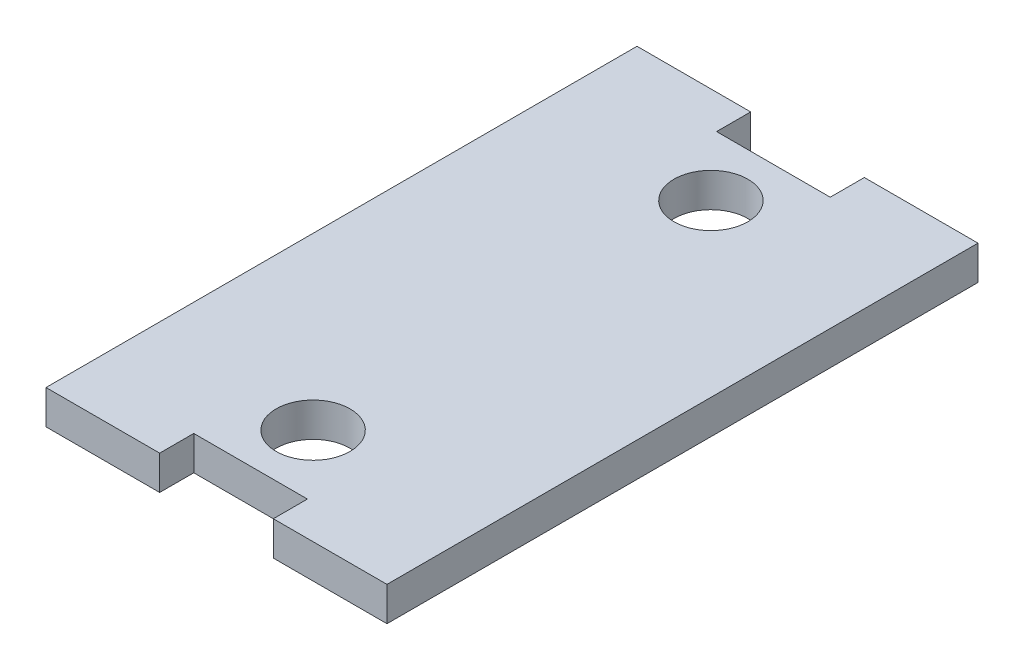
ISO-10303-21;
HEADER;
FILE_DESCRIPTION(('STEP AP214'),'2;1');
FILE_NAME('part.step','',(''),(''),'','','');
FILE_SCHEMA(('AUTOMOTIVE_DESIGN { 1 0 10303 214 1 1 1 1 }'));
ENDSEC;
DATA;
#1=APPLICATION_CONTEXT('core data for automotive mechanical design processes');
#2=APPLICATION_PROTOCOL_DEFINITION('international standard','automotive_design',2000,#1);
#3=PRODUCT_CONTEXT('',#1,'mechanical');
#4=PRODUCT('Part','Part','',(#3));
#5=PRODUCT_RELATED_PRODUCT_CATEGORY('part','',(#4));
#6=PRODUCT_DEFINITION_FORMATION('','',#4);
#7=PRODUCT_DEFINITION_CONTEXT('part definition',#1,'design');
#8=PRODUCT_DEFINITION('design','',#6,#7);
#9=PRODUCT_DEFINITION_SHAPE('','',#8);
#10=(LENGTH_UNIT() NAMED_UNIT(*) SI_UNIT(.MILLI.,.METRE.));
#11=(NAMED_UNIT(*) PLANE_ANGLE_UNIT() SI_UNIT($,.RADIAN.));
#12=(NAMED_UNIT(*) SI_UNIT($,.STERADIAN.) SOLID_ANGLE_UNIT());
#13=UNCERTAINTY_MEASURE_WITH_UNIT(LENGTH_MEASURE(1.E-05),#10,'distance_accuracy_value','');
#14=(GEOMETRIC_REPRESENTATION_CONTEXT(3) GLOBAL_UNCERTAINTY_ASSIGNED_CONTEXT((#13)) GLOBAL_UNIT_ASSIGNED_CONTEXT((#10,
#11,#12)) REPRESENTATION_CONTEXT('',''));
#15=CARTESIAN_POINT('',(0.,0.,0.));
#16=DIRECTION('',(0.,0.,1.));
#17=DIRECTION('',(1.,0.,0.));
#18=AXIS2_PLACEMENT_3D('',#15,#16,#17);
#19=CARTESIAN_POINT('',(0.,1.5,0.));
#20=DIRECTION('',(0.,-1.,0.));
#21=DIRECTION('',(0.,0.,-1.));
#22=AXIS2_PLACEMENT_3D('',#19,#20,#21);
#23=PLANE('',#22);
#24=DIRECTION('',(1.,0.,0.));
#25=VECTOR('',#24,1.);
#26=CARTESIAN_POINT('',(2.5,1.5,13.));
#27=LINE('',#26,#25);
#28=CARTESIAN_POINT('',(2.5,1.5,13.));
#29=VERTEX_POINT('',#28);
#30=CARTESIAN_POINT('',(7.5,1.5,13.));
#31=VERTEX_POINT('',#30);
#32=EDGE_CURVE('E179',#29,#31,#27,.T.);
#33=ORIENTED_EDGE('',*,*,#32,.T.);
#34=DIRECTION('',(0.,0.,-1.));
#35=VECTOR('',#34,1.);
#36=CARTESIAN_POINT('',(7.5,1.5,-13.));
#37=LINE('',#36,#35);
#38=CARTESIAN_POINT('',(7.5,1.5,-13.));
#39=VERTEX_POINT('',#38);
#40=EDGE_CURVE('E107',#31,#39,#37,.T.);
#41=ORIENTED_EDGE('',*,*,#40,.T.);
#42=DIRECTION('',(-1.,0.,0.));
#43=VECTOR('',#42,1.);
#44=CARTESIAN_POINT('',(2.5,1.5,-13.));
#45=LINE('',#44,#43);
#46=CARTESIAN_POINT('',(2.5,1.5,-13.));
#47=VERTEX_POINT('',#46);
#48=EDGE_CURVE('E206',#39,#47,#45,.T.);
#49=ORIENTED_EDGE('',*,*,#48,.T.);
#50=DIRECTION('',(0.,0.,1.));
#51=VECTOR('',#50,1.);
#52=CARTESIAN_POINT('',(2.5,1.5,-11.5));
#53=LINE('',#52,#51);
#54=CARTESIAN_POINT('',(2.5,1.5,-11.5));
#55=VERTEX_POINT('',#54);
#56=EDGE_CURVE('E225',#47,#55,#53,.T.);
#57=ORIENTED_EDGE('',*,*,#56,.T.);
#58=DIRECTION('',(-1.,0.,0.));
#59=VECTOR('',#58,1.);
#60=CARTESIAN_POINT('',(2.5,1.5,-11.5));
#61=LINE('',#60,#59);
#62=CARTESIAN_POINT('',(-2.5,1.5,-11.5));
#63=VERTEX_POINT('',#62);
#64=EDGE_CURVE('E222',#55,#63,#61,.T.);
#65=ORIENTED_EDGE('',*,*,#64,.T.);
#66=DIRECTION('',(0.,0.,-1.));
#67=VECTOR('',#66,1.);
#68=CARTESIAN_POINT('',(-2.5,1.5,-11.5));
#69=LINE('',#68,#67);
#70=CARTESIAN_POINT('',(-2.5,1.5,-13.));
#71=VERTEX_POINT('',#70);
#72=EDGE_CURVE('E224',#63,#71,#69,.T.);
#73=ORIENTED_EDGE('',*,*,#72,.T.);
#74=DIRECTION('',(-1.,0.,0.));
#75=VECTOR('',#74,1.);
#76=CARTESIAN_POINT('',(-7.5,1.5,-13.));
#77=LINE('',#76,#75);
#78=CARTESIAN_POINT('',(-7.5,1.5,-13.));
#79=VERTEX_POINT('',#78);
#80=EDGE_CURVE('E227',#71,#79,#77,.T.);
#81=ORIENTED_EDGE('',*,*,#80,.T.);
#82=DIRECTION('',(0.,0.,1.));
#83=VECTOR('',#82,1.);
#84=CARTESIAN_POINT('',(-7.5,1.5,-13.));
#85=LINE('',#84,#83);
#86=CARTESIAN_POINT('',(-7.5,1.5,13.));
#87=VERTEX_POINT('',#86);
#88=EDGE_CURVE('E233',#79,#87,#85,.T.);
#89=ORIENTED_EDGE('',*,*,#88,.T.);
#90=DIRECTION('',(1.,0.,0.));
#91=VECTOR('',#90,1.);
#92=CARTESIAN_POINT('',(-7.5,1.5,13.));
#93=LINE('',#92,#91);
#94=CARTESIAN_POINT('',(-2.5,1.5,13.));
#95=VERTEX_POINT('',#94);
#96=EDGE_CURVE('E138',#87,#95,#93,.T.);
#97=ORIENTED_EDGE('',*,*,#96,.T.);
#98=DIRECTION('',(0.,0.,-1.));
#99=VECTOR('',#98,1.);
#100=CARTESIAN_POINT('',(-2.5,1.5,11.5));
#101=LINE('',#100,#99);
#102=CARTESIAN_POINT('',(-2.5,1.5,11.5));
#103=VERTEX_POINT('',#102);
#104=EDGE_CURVE('E132',#95,#103,#101,.T.);
#105=ORIENTED_EDGE('',*,*,#104,.T.);
#106=DIRECTION('',(1.,0.,0.));
#107=VECTOR('',#106,1.);
#108=CARTESIAN_POINT('',(2.5,1.5,11.5));
#109=LINE('',#108,#107);
#110=CARTESIAN_POINT('',(2.5,1.5,11.5));
#111=VERTEX_POINT('',#110);
#112=EDGE_CURVE('E136',#103,#111,#109,.T.);
#113=ORIENTED_EDGE('',*,*,#112,.T.);
#114=DIRECTION('',(0.,0.,1.));
#115=VECTOR('',#114,1.);
#116=CARTESIAN_POINT('',(2.5,1.5,11.5));
#117=LINE('',#116,#115);
#118=EDGE_CURVE('E52',#111,#29,#117,.T.);
#119=ORIENTED_EDGE('',*,*,#118,.T.);
#120=EDGE_LOOP('',(#33,#41,#49,#57,#65,#73,#81,#89,#97,#105,#113,#119));
#121=FACE_BOUND('',#120,.T.);
#122=CARTESIAN_POINT('',(0.,1.5,-8.75));
#123=DIRECTION('',(0.,1.,0.));
#124=DIRECTION('',(0.,0.,1.));
#125=AXIS2_PLACEMENT_3D('',#122,#123,#124);
#126=CIRCLE('',#125,1.625);
#127=CARTESIAN_POINT('',(0.,1.5,-7.125));
#128=VERTEX_POINT('',#127);
#129=EDGE_CURVE('E160',#128,#128,#126,.T.);
#130=ORIENTED_EDGE('',*,*,#129,.F.);
#131=EDGE_LOOP('',(#130));
#132=FACE_BOUND('',#131,.T.);
#133=CARTESIAN_POINT('',(0.,1.5,8.75));
#134=DIRECTION('',(0.,1.,0.));
#135=DIRECTION('',(0.,0.,-1.));
#136=AXIS2_PLACEMENT_3D('',#133,#134,#135);
#137=CIRCLE('',#136,1.625);
#138=CARTESIAN_POINT('',(0.,1.5,7.125));
#139=VERTEX_POINT('',#138);
#140=EDGE_CURVE('E274',#139,#139,#137,.T.);
#141=ORIENTED_EDGE('',*,*,#140,.F.);
#142=EDGE_LOOP('',(#141));
#143=FACE_BOUND('',#142,.T.);
#144=ADVANCED_FACE('F35',(#121,#132,#143),#23,.F.);
#145=CARTESIAN_POINT('',(0.,0.,0.));
#146=DIRECTION('',(0.,-1.,0.));
#147=DIRECTION('',(0.,0.,-1.));
#148=AXIS2_PLACEMENT_3D('',#145,#146,#147);
#149=PLANE('',#148);
#150=CARTESIAN_POINT('',(0.,0.,-8.75));
#151=DIRECTION('',(0.,1.,0.));
#152=DIRECTION('',(0.,0.,1.));
#153=AXIS2_PLACEMENT_3D('',#150,#151,#152);
#154=CIRCLE('',#153,1.625);
#155=CARTESIAN_POINT('',(0.,0.,-7.125));
#156=VERTEX_POINT('',#155);
#157=EDGE_CURVE('E279',#156,#156,#154,.T.);
#158=ORIENTED_EDGE('',*,*,#157,.T.);
#159=EDGE_LOOP('',(#158));
#160=FACE_BOUND('',#159,.T.);
#161=DIRECTION('',(1.,0.,0.));
#162=VECTOR('',#161,1.);
#163=CARTESIAN_POINT('',(2.5,0.,13.));
#164=LINE('',#163,#162);
#165=CARTESIAN_POINT('',(2.5,0.,13.));
#166=VERTEX_POINT('',#165);
#167=CARTESIAN_POINT('',(7.5,0.,13.));
#168=VERTEX_POINT('',#167);
#169=EDGE_CURVE('E156',#166,#168,#164,.T.);
#170=ORIENTED_EDGE('',*,*,#169,.F.);
#171=DIRECTION('',(0.,0.,1.));
#172=VECTOR('',#171,1.);
#173=CARTESIAN_POINT('',(2.5,0.,11.5));
#174=LINE('',#173,#172);
#175=CARTESIAN_POINT('',(2.5,0.,11.5));
#176=VERTEX_POINT('',#175);
#177=EDGE_CURVE('E99',#176,#166,#174,.T.);
#178=ORIENTED_EDGE('',*,*,#177,.F.);
#179=DIRECTION('',(1.,0.,0.));
#180=VECTOR('',#179,1.);
#181=CARTESIAN_POINT('',(2.5,0.,11.5));
#182=LINE('',#181,#180);
#183=CARTESIAN_POINT('',(-2.5,0.,11.5));
#184=VERTEX_POINT('',#183);
#185=EDGE_CURVE('E93',#184,#176,#182,.T.);
#186=ORIENTED_EDGE('',*,*,#185,.F.);
#187=DIRECTION('',(0.,0.,-1.));
#188=VECTOR('',#187,1.);
#189=CARTESIAN_POINT('',(-2.5,0.,11.5));
#190=LINE('',#189,#188);
#191=CARTESIAN_POINT('',(-2.5,0.,13.));
#192=VERTEX_POINT('',#191);
#193=EDGE_CURVE('E146',#192,#184,#190,.T.);
#194=ORIENTED_EDGE('',*,*,#193,.F.);
#195=DIRECTION('',(1.,0.,0.));
#196=VECTOR('',#195,1.);
#197=CARTESIAN_POINT('',(-7.5,0.,13.));
#198=LINE('',#197,#196);
#199=CARTESIAN_POINT('',(-7.5,0.,13.));
#200=VERTEX_POINT('',#199);
#201=EDGE_CURVE('E174',#200,#192,#198,.T.);
#202=ORIENTED_EDGE('',*,*,#201,.F.);
#203=DIRECTION('',(0.,0.,1.));
#204=VECTOR('',#203,1.);
#205=CARTESIAN_POINT('',(-7.5,0.,-13.));
#206=LINE('',#205,#204);
#207=CARTESIAN_POINT('',(-7.5,0.,-13.));
#208=VERTEX_POINT('',#207);
#209=EDGE_CURVE('E172',#208,#200,#206,.T.);
#210=ORIENTED_EDGE('',*,*,#209,.F.);
#211=DIRECTION('',(-1.,0.,0.));
#212=VECTOR('',#211,1.);
#213=CARTESIAN_POINT('',(-7.5,0.,-13.));
#214=LINE('',#213,#212);
#215=CARTESIAN_POINT('',(-2.5,0.,-13.));
#216=VERTEX_POINT('',#215);
#217=EDGE_CURVE('E170',#216,#208,#214,.T.);
#218=ORIENTED_EDGE('',*,*,#217,.F.);
#219=DIRECTION('',(0.,0.,-1.));
#220=VECTOR('',#219,1.);
#221=CARTESIAN_POINT('',(-2.5,0.,-11.5));
#222=LINE('',#221,#220);
#223=CARTESIAN_POINT('',(-2.5,0.,-11.5));
#224=VERTEX_POINT('',#223);
#225=EDGE_CURVE('E168',#224,#216,#222,.T.);
#226=ORIENTED_EDGE('',*,*,#225,.F.);
#227=DIRECTION('',(-1.,0.,0.));
#228=VECTOR('',#227,1.);
#229=CARTESIAN_POINT('',(2.5,0.,-11.5));
#230=LINE('',#229,#228);
#231=CARTESIAN_POINT('',(2.5,0.,-11.5));
#232=VERTEX_POINT('',#231);
#233=EDGE_CURVE('E166',#232,#224,#230,.T.);
#234=ORIENTED_EDGE('',*,*,#233,.F.);
#235=DIRECTION('',(0.,0.,1.));
#236=VECTOR('',#235,1.);
#237=CARTESIAN_POINT('',(2.5,0.,-11.5));
#238=LINE('',#237,#236);
#239=CARTESIAN_POINT('',(2.5,0.,-13.));
#240=VERTEX_POINT('',#239);
#241=EDGE_CURVE('E164',#240,#232,#238,.T.);
#242=ORIENTED_EDGE('',*,*,#241,.F.);
#243=DIRECTION('',(-1.,0.,0.));
#244=VECTOR('',#243,1.);
#245=CARTESIAN_POINT('',(2.5,0.,-13.));
#246=LINE('',#245,#244);
#247=CARTESIAN_POINT('',(7.5,0.,-13.));
#248=VERTEX_POINT('',#247);
#249=EDGE_CURVE('E162',#248,#240,#246,.T.);
#250=ORIENTED_EDGE('',*,*,#249,.F.);
#251=DIRECTION('',(0.,0.,-1.));
#252=VECTOR('',#251,1.);
#253=CARTESIAN_POINT('',(7.5,0.,-13.));
#254=LINE('',#253,#252);
#255=EDGE_CURVE('E159',#168,#248,#254,.T.);
#256=ORIENTED_EDGE('',*,*,#255,.F.);
#257=EDGE_LOOP('',(#170,#178,#186,#194,#202,#210,#218,#226,#234,#242,#250,#256));
#258=FACE_BOUND('',#257,.T.);
#259=CARTESIAN_POINT('',(0.,0.,8.75));
#260=DIRECTION('',(0.,1.,0.));
#261=DIRECTION('',(0.,0.,-1.));
#262=AXIS2_PLACEMENT_3D('',#259,#260,#261);
#263=CIRCLE('',#262,1.625);
#264=CARTESIAN_POINT('',(0.,0.,7.125));
#265=VERTEX_POINT('',#264);
#266=EDGE_CURVE('E277',#265,#265,#263,.T.);
#267=ORIENTED_EDGE('',*,*,#266,.T.);
#268=EDGE_LOOP('',(#267));
#269=FACE_BOUND('',#268,.T.);
#270=ADVANCED_FACE('F210',(#160,#258,#269),#149,.T.);
#271=CARTESIAN_POINT('',(2.5,1.5,13.));
#272=DIRECTION('',(0.,0.,-1.));
#273=DIRECTION('',(-1.,0.,0.));
#274=AXIS2_PLACEMENT_3D('',#271,#272,#273);
#275=PLANE('',#274);
#276=ORIENTED_EDGE('',*,*,#169,.T.);
#277=DIRECTION('',(0.,-1.,0.));
#278=VECTOR('',#277,1.);
#279=CARTESIAN_POINT('',(7.5,1.5,13.));
#280=LINE('',#279,#278);
#281=EDGE_CURVE('E11',#31,#168,#280,.T.);
#282=ORIENTED_EDGE('',*,*,#281,.F.);
#283=ORIENTED_EDGE('',*,*,#32,.F.);
#284=DIRECTION('',(0.,-1.,0.));
#285=VECTOR('',#284,1.);
#286=CARTESIAN_POINT('',(2.5,1.5,13.));
#287=LINE('',#286,#285);
#288=EDGE_CURVE('E152',#29,#166,#287,.T.);
#289=ORIENTED_EDGE('',*,*,#288,.T.);
#290=EDGE_LOOP('',(#276,#282,#283,#289));
#291=FACE_BOUND('',#290,.T.);
#292=ADVANCED_FACE('F37',(#291),#275,.F.);
#293=CARTESIAN_POINT('',(7.5,1.5,-13.));
#294=DIRECTION('',(-1.,0.,0.));
#295=DIRECTION('',(0.,0.,1.));
#296=AXIS2_PLACEMENT_3D('',#293,#294,#295);
#297=PLANE('',#296);
#298=ORIENTED_EDGE('',*,*,#255,.T.);
#299=DIRECTION('',(0.,-1.,0.));
#300=VECTOR('',#299,1.);
#301=CARTESIAN_POINT('',(7.5,1.5,-13.));
#302=LINE('',#301,#300);
#303=EDGE_CURVE('E44',#39,#248,#302,.T.);
#304=ORIENTED_EDGE('',*,*,#303,.F.);
#305=ORIENTED_EDGE('',*,*,#40,.F.);
#306=ORIENTED_EDGE('',*,*,#281,.T.);
#307=EDGE_LOOP('',(#298,#304,#305,#306));
#308=FACE_BOUND('',#307,.T.);
#309=ADVANCED_FACE('F374',(#308),#297,.F.);
#310=CARTESIAN_POINT('',(2.5,1.5,-13.));
#311=DIRECTION('',(0.,0.,1.));
#312=DIRECTION('',(1.,0.,0.));
#313=AXIS2_PLACEMENT_3D('',#310,#311,#312);
#314=PLANE('',#313);
#315=ORIENTED_EDGE('',*,*,#249,.T.);
#316=DIRECTION('',(0.,-1.,0.));
#317=VECTOR('',#316,1.);
#318=CARTESIAN_POINT('',(2.5,1.5,-13.));
#319=LINE('',#318,#317);
#320=EDGE_CURVE('E198',#47,#240,#319,.T.);
#321=ORIENTED_EDGE('',*,*,#320,.F.);
#322=ORIENTED_EDGE('',*,*,#48,.F.);
#323=ORIENTED_EDGE('',*,*,#303,.T.);
#324=EDGE_LOOP('',(#315,#321,#322,#323));
#325=FACE_BOUND('',#324,.T.);
#326=ADVANCED_FACE('F204',(#325),#314,.F.);
#327=CARTESIAN_POINT('',(2.5,1.5,-11.5));
#328=DIRECTION('',(1.,0.,0.));
#329=DIRECTION('',(0.,0.,-1.));
#330=AXIS2_PLACEMENT_3D('',#327,#328,#329);
#331=PLANE('',#330);
#332=ORIENTED_EDGE('',*,*,#241,.T.);
#333=DIRECTION('',(0.,-1.,0.));
#334=VECTOR('',#333,1.);
#335=CARTESIAN_POINT('',(2.5,1.5,-11.5));
#336=LINE('',#335,#334);
#337=EDGE_CURVE('E195',#55,#232,#336,.T.);
#338=ORIENTED_EDGE('',*,*,#337,.F.);
#339=ORIENTED_EDGE('',*,*,#56,.F.);
#340=ORIENTED_EDGE('',*,*,#320,.T.);
#341=EDGE_LOOP('',(#332,#338,#339,#340));
#342=FACE_BOUND('',#341,.T.);
#343=ADVANCED_FACE('F216',(#342),#331,.F.);
#344=CARTESIAN_POINT('',(2.5,1.5,-11.5));
#345=DIRECTION('',(0.,0.,1.));
#346=DIRECTION('',(1.,0.,0.));
#347=AXIS2_PLACEMENT_3D('',#344,#345,#346);
#348=PLANE('',#347);
#349=ORIENTED_EDGE('',*,*,#233,.T.);
#350=DIRECTION('',(0.,-1.,0.));
#351=VECTOR('',#350,1.);
#352=CARTESIAN_POINT('',(-2.5,1.5,-11.5));
#353=LINE('',#352,#351);
#354=EDGE_CURVE('E192',#63,#224,#353,.T.);
#355=ORIENTED_EDGE('',*,*,#354,.F.);
#356=ORIENTED_EDGE('',*,*,#64,.F.);
#357=ORIENTED_EDGE('',*,*,#337,.T.);
#358=EDGE_LOOP('',(#349,#355,#356,#357));
#359=FACE_BOUND('',#358,.T.);
#360=ADVANCED_FACE('F220',(#359),#348,.F.);
#361=CARTESIAN_POINT('',(-2.5,1.5,-11.5));
#362=DIRECTION('',(-1.,0.,0.));
#363=DIRECTION('',(0.,0.,1.));
#364=AXIS2_PLACEMENT_3D('',#361,#362,#363);
#365=PLANE('',#364);
#366=ORIENTED_EDGE('',*,*,#225,.T.);
#367=DIRECTION('',(0.,-1.,0.));
#368=VECTOR('',#367,1.);
#369=CARTESIAN_POINT('',(-2.5,1.5,-13.));
#370=LINE('',#369,#368);
#371=EDGE_CURVE('E189',#71,#216,#370,.T.);
#372=ORIENTED_EDGE('',*,*,#371,.F.);
#373=ORIENTED_EDGE('',*,*,#72,.F.);
#374=ORIENTED_EDGE('',*,*,#354,.T.);
#375=EDGE_LOOP('',(#366,#372,#373,#374));
#376=FACE_BOUND('',#375,.T.);
#377=ADVANCED_FACE('F339',(#376),#365,.F.);
#378=CARTESIAN_POINT('',(-7.5,1.5,-13.));
#379=DIRECTION('',(0.,0.,1.));
#380=DIRECTION('',(1.,0.,0.));
#381=AXIS2_PLACEMENT_3D('',#378,#379,#380);
#382=PLANE('',#381);
#383=ORIENTED_EDGE('',*,*,#217,.T.);
#384=DIRECTION('',(0.,-1.,0.));
#385=VECTOR('',#384,1.);
#386=CARTESIAN_POINT('',(-7.5,1.5,-13.));
#387=LINE('',#386,#385);
#388=EDGE_CURVE('E186',#79,#208,#387,.T.);
#389=ORIENTED_EDGE('',*,*,#388,.F.);
#390=ORIENTED_EDGE('',*,*,#80,.F.);
#391=ORIENTED_EDGE('',*,*,#371,.T.);
#392=EDGE_LOOP('',(#383,#389,#390,#391));
#393=FACE_BOUND('',#392,.T.);
#394=ADVANCED_FACE('F330',(#393),#382,.F.);
#395=CARTESIAN_POINT('',(-7.5,1.5,-13.));
#396=DIRECTION('',(1.,0.,0.));
#397=DIRECTION('',(0.,0.,-1.));
#398=AXIS2_PLACEMENT_3D('',#395,#396,#397);
#399=PLANE('',#398);
#400=ORIENTED_EDGE('',*,*,#209,.T.);
#401=DIRECTION('',(0.,-1.,0.));
#402=VECTOR('',#401,1.);
#403=CARTESIAN_POINT('',(-7.5,1.5,13.));
#404=LINE('',#403,#402);
#405=EDGE_CURVE('E183',#87,#200,#404,.T.);
#406=ORIENTED_EDGE('',*,*,#405,.F.);
#407=ORIENTED_EDGE('',*,*,#88,.F.);
#408=ORIENTED_EDGE('',*,*,#388,.T.);
#409=EDGE_LOOP('',(#400,#406,#407,#408));
#410=FACE_BOUND('',#409,.T.);
#411=ADVANCED_FACE('F239',(#410),#399,.F.);
#412=CARTESIAN_POINT('',(-7.5,1.5,13.));
#413=DIRECTION('',(0.,0.,-1.));
#414=DIRECTION('',(-1.,0.,0.));
#415=AXIS2_PLACEMENT_3D('',#412,#413,#414);
#416=PLANE('',#415);
#417=ORIENTED_EDGE('',*,*,#201,.T.);
#418=DIRECTION('',(0.,-1.,0.));
#419=VECTOR('',#418,1.);
#420=CARTESIAN_POINT('',(-2.5,1.5,13.));
#421=LINE('',#420,#419);
#422=EDGE_CURVE('E147',#95,#192,#421,.T.);
#423=ORIENTED_EDGE('',*,*,#422,.F.);
#424=ORIENTED_EDGE('',*,*,#96,.F.);
#425=ORIENTED_EDGE('',*,*,#405,.T.);
#426=EDGE_LOOP('',(#417,#423,#424,#425));
#427=FACE_BOUND('',#426,.T.);
#428=ADVANCED_FACE('F243',(#427),#416,.F.);
#429=CARTESIAN_POINT('',(-2.5,1.5,11.5));
#430=DIRECTION('',(-1.,0.,0.));
#431=DIRECTION('',(0.,0.,1.));
#432=AXIS2_PLACEMENT_3D('',#429,#430,#431);
#433=PLANE('',#432);
#434=ORIENTED_EDGE('',*,*,#193,.T.);
#435=DIRECTION('',(0.,-1.,0.));
#436=VECTOR('',#435,1.);
#437=CARTESIAN_POINT('',(-2.5,1.5,11.5));
#438=LINE('',#437,#436);
#439=EDGE_CURVE('E143',#103,#184,#438,.T.);
#440=ORIENTED_EDGE('',*,*,#439,.F.);
#441=ORIENTED_EDGE('',*,*,#104,.F.);
#442=ORIENTED_EDGE('',*,*,#422,.T.);
#443=EDGE_LOOP('',(#434,#440,#441,#442));
#444=FACE_BOUND('',#443,.T.);
#445=ADVANCED_FACE('F144',(#444),#433,.F.);
#446=CARTESIAN_POINT('',(2.5,1.5,11.5));
#447=DIRECTION('',(0.,0.,-1.));
#448=DIRECTION('',(-1.,0.,0.));
#449=AXIS2_PLACEMENT_3D('',#446,#447,#448);
#450=PLANE('',#449);
#451=ORIENTED_EDGE('',*,*,#185,.T.);
#452=DIRECTION('',(0.,-1.,0.));
#453=VECTOR('',#452,1.);
#454=CARTESIAN_POINT('',(2.5,1.5,11.5));
#455=LINE('',#454,#453);
#456=EDGE_CURVE('E148',#111,#176,#455,.T.);
#457=ORIENTED_EDGE('',*,*,#456,.F.);
#458=ORIENTED_EDGE('',*,*,#112,.F.);
#459=ORIENTED_EDGE('',*,*,#439,.T.);
#460=EDGE_LOOP('',(#451,#457,#458,#459));
#461=FACE_BOUND('',#460,.T.);
#462=ADVANCED_FACE('F150',(#461),#450,.F.);
#463=CARTESIAN_POINT('',(2.5,1.5,11.5));
#464=DIRECTION('',(1.,0.,0.));
#465=DIRECTION('',(0.,0.,-1.));
#466=AXIS2_PLACEMENT_3D('',#463,#464,#465);
#467=PLANE('',#466);
#468=ORIENTED_EDGE('',*,*,#177,.T.);
#469=ORIENTED_EDGE('',*,*,#288,.F.);
#470=ORIENTED_EDGE('',*,*,#118,.F.);
#471=ORIENTED_EDGE('',*,*,#456,.T.);
#472=EDGE_LOOP('',(#468,#469,#470,#471));
#473=FACE_BOUND('',#472,.T.);
#474=ADVANCED_FACE('F247',(#473),#467,.F.);
#475=CARTESIAN_POINT('',(0.,1.5,-8.75));
#476=DIRECTION('',(0.,-1.,0.));
#477=DIRECTION('',(0.,0.,-1.));
#478=AXIS2_PLACEMENT_3D('',#475,#476,#477);
#479=CYLINDRICAL_SURFACE('',#478,1.625);
#480=ORIENTED_EDGE('',*,*,#129,.T.);
#481=EDGE_LOOP('',(#480));
#482=FACE_BOUND('',#481,.T.);
#483=ORIENTED_EDGE('',*,*,#157,.F.);
#484=EDGE_LOOP('',(#483));
#485=FACE_BOUND('',#484,.T.);
#486=ADVANCED_FACE('F249',(#482,#485),#479,.F.);
#487=CARTESIAN_POINT('',(0.,1.5,8.75));
#488=DIRECTION('',(0.,-1.,0.));
#489=DIRECTION('',(0.,0.,-1.));
#490=AXIS2_PLACEMENT_3D('',#487,#488,#489);
#491=CYLINDRICAL_SURFACE('',#490,1.625);
#492=ORIENTED_EDGE('',*,*,#140,.T.);
#493=EDGE_LOOP('',(#492));
#494=FACE_BOUND('',#493,.T.);
#495=ORIENTED_EDGE('',*,*,#266,.F.);
#496=EDGE_LOOP('',(#495));
#497=FACE_BOUND('',#496,.T.);
#498=ADVANCED_FACE('F255',(#494,#497),#491,.F.);
#499=CLOSED_SHELL('',(#144,#270,#292,#309,#326,#343,#360,#377,#394,#411,#428,#445,#462,#474,
#486,#498));
#500=MANIFOLD_SOLID_BREP('B2',#499);
#501=ADVANCED_BREP_SHAPE_REPRESENTATION('',(#18,#500),#14);
#502=SHAPE_DEFINITION_REPRESENTATION(#9,#501);
ENDSEC;
END-ISO-10303-21;
